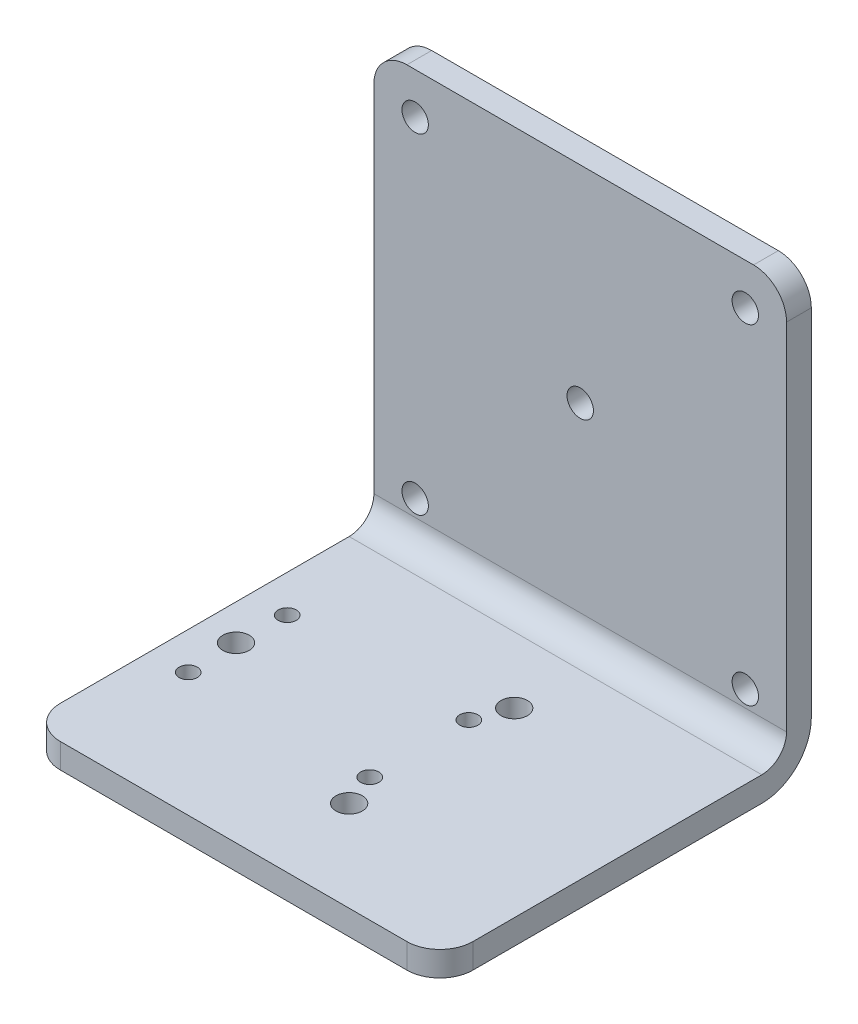
ISO-10303-21;
HEADER;
FILE_DESCRIPTION(('STEP AP214'),'2;1');
FILE_NAME('part.step','',(''),(''),'','','');
FILE_SCHEMA(('AUTOMOTIVE_DESIGN { 1 0 10303 214 1 1 1 1 }'));
ENDSEC;
DATA;
#1=APPLICATION_CONTEXT('core data for automotive mechanical design processes');
#2=APPLICATION_PROTOCOL_DEFINITION('international standard','automotive_design',2000,#1);
#3=PRODUCT_CONTEXT('',#1,'mechanical');
#4=PRODUCT('Part','Part','',(#3));
#5=PRODUCT_RELATED_PRODUCT_CATEGORY('part','',(#4));
#6=PRODUCT_DEFINITION_FORMATION('','',#4);
#7=PRODUCT_DEFINITION_CONTEXT('part definition',#1,'design');
#8=PRODUCT_DEFINITION('design','',#6,#7);
#9=PRODUCT_DEFINITION_SHAPE('','',#8);
#10=(LENGTH_UNIT() NAMED_UNIT(*) SI_UNIT(.MILLI.,.METRE.));
#11=(NAMED_UNIT(*) PLANE_ANGLE_UNIT() SI_UNIT($,.RADIAN.));
#12=(NAMED_UNIT(*) SI_UNIT($,.STERADIAN.) SOLID_ANGLE_UNIT());
#13=UNCERTAINTY_MEASURE_WITH_UNIT(LENGTH_MEASURE(1.E-05),#10,'distance_accuracy_value','');
#14=(GEOMETRIC_REPRESENTATION_CONTEXT(3) GLOBAL_UNCERTAINTY_ASSIGNED_CONTEXT((#13)) GLOBAL_UNIT_ASSIGNED_CONTEXT((#10,
#11,#12)) REPRESENTATION_CONTEXT('',''));
#15=CARTESIAN_POINT('',(0.,0.,0.));
#16=DIRECTION('',(0.,0.,1.));
#17=DIRECTION('',(1.,0.,0.));
#18=AXIS2_PLACEMENT_3D('',#15,#16,#17);
#19=CARTESIAN_POINT('',(0.,3.,0.));
#20=DIRECTION('',(0.,-1.,0.));
#21=DIRECTION('',(0.,0.,-1.));
#22=AXIS2_PLACEMENT_3D('',#19,#20,#21);
#23=PLANE('',#22);
#24=CARTESIAN_POINT('',(2.99999999999999,3.,-8.5));
#25=DIRECTION('',(0.,1.,0.));
#26=DIRECTION('',(0.,0.,1.));
#27=AXIS2_PLACEMENT_3D('',#24,#25,#26);
#28=CIRCLE('',#27,1.6);
#29=CARTESIAN_POINT('',(2.99999999999999,3.,-6.9));
#30=VERTEX_POINT('',#29);
#31=EDGE_CURVE('E518',#30,#30,#28,.T.);
#32=ORIENTED_EDGE('',*,*,#31,.F.);
#33=EDGE_LOOP('',(#32));
#34=FACE_BOUND('',#33,.T.);
#35=CARTESIAN_POINT('',(-20.5,3.,7.5));
#36=DIRECTION('',(0.,1.,0.));
#37=DIRECTION('',(0.,0.,-1.));
#38=AXIS2_PLACEMENT_3D('',#35,#36,#37);
#39=CIRCLE('',#38,1.1);
#40=CARTESIAN_POINT('',(-20.5,3.,6.4));
#41=VERTEX_POINT('',#40);
#42=EDGE_CURVE('E534',#41,#41,#39,.T.);
#43=ORIENTED_EDGE('',*,*,#42,.F.);
#44=EDGE_LOOP('',(#43));
#45=FACE_BOUND('',#44,.T.);
#46=CARTESIAN_POINT('',(-20.5,3.,-4.5));
#47=DIRECTION('',(0.,1.,0.));
#48=DIRECTION('',(0.,0.,1.));
#49=AXIS2_PLACEMENT_3D('',#46,#47,#48);
#50=CIRCLE('',#49,1.1);
#51=CARTESIAN_POINT('',(-20.5,3.,-3.4));
#52=VERTEX_POINT('',#51);
#53=EDGE_CURVE('E533',#52,#52,#50,.T.);
#54=ORIENTED_EDGE('',*,*,#53,.F.);
#55=EDGE_LOOP('',(#54));
#56=FACE_BOUND('',#55,.T.);
#57=CARTESIAN_POINT('',(1.49999999999998,3.,-4.5));
#58=DIRECTION('',(0.,1.,0.));
#59=DIRECTION('',(0.,0.,1.));
#60=AXIS2_PLACEMENT_3D('',#57,#58,#59);
#61=CIRCLE('',#60,1.1);
#62=CARTESIAN_POINT('',(1.49999999999998,3.,-3.4));
#63=VERTEX_POINT('',#62);
#64=EDGE_CURVE('E511',#63,#63,#61,.T.);
#65=ORIENTED_EDGE('',*,*,#64,.F.);
#66=EDGE_LOOP('',(#65));
#67=FACE_BOUND('',#66,.T.);
#68=CARTESIAN_POINT('',(2.99999999999999,3.,11.5));
#69=DIRECTION('',(0.,1.,0.));
#70=DIRECTION('',(0.,0.,-1.));
#71=AXIS2_PLACEMENT_3D('',#68,#69,#70);
#72=CIRCLE('',#71,1.6);
#73=CARTESIAN_POINT('',(2.99999999999999,3.,9.9));
#74=VERTEX_POINT('',#73);
#75=EDGE_CURVE('E519',#74,#74,#72,.T.);
#76=ORIENTED_EDGE('',*,*,#75,.F.);
#77=EDGE_LOOP('',(#76));
#78=FACE_BOUND('',#77,.T.);
#79=CARTESIAN_POINT('',(-20.7,3.,1.5));
#80=DIRECTION('',(0.,1.,0.));
#81=DIRECTION('',(0.,0.,1.));
#82=AXIS2_PLACEMENT_3D('',#79,#80,#81);
#83=CIRCLE('',#82,1.60000000000001);
#84=CARTESIAN_POINT('',(-20.7,3.,3.10000000000001));
#85=VERTEX_POINT('',#84);
#86=EDGE_CURVE('E502',#85,#85,#83,.T.);
#87=ORIENTED_EDGE('',*,*,#86,.F.);
#88=EDGE_LOOP('',(#87));
#89=FACE_BOUND('',#88,.T.);
#90=CARTESIAN_POINT('',(1.49999999999998,3.,7.5));
#91=DIRECTION('',(0.,1.,0.));
#92=DIRECTION('',(0.,0.,-1.));
#93=AXIS2_PLACEMENT_3D('',#90,#91,#92);
#94=CIRCLE('',#93,1.1);
#95=CARTESIAN_POINT('',(1.49999999999998,3.,6.4));
#96=VERTEX_POINT('',#95);
#97=EDGE_CURVE('E497',#96,#96,#94,.T.);
#98=ORIENTED_EDGE('',*,*,#97,.F.);
#99=EDGE_LOOP('',(#98));
#100=FACE_BOUND('',#99,.T.);
#101=DIRECTION('',(0.,0.,-1.));
#102=VECTOR('',#101,1.);
#103=CARTESIAN_POINT('',(25.,3.,22.5));
#104=LINE('',#103,#102);
#105=CARTESIAN_POINT('',(25.,3.,18.5));
#106=VERTEX_POINT('',#105);
#107=CARTESIAN_POINT('',(25.,3.,-16.5));
#108=VERTEX_POINT('',#107);
#109=EDGE_CURVE('E139',#106,#108,#104,.T.);
#110=ORIENTED_EDGE('',*,*,#109,.T.);
#111=DIRECTION('',(1.,0.,0.));
#112=VECTOR('',#111,1.);
#113=CARTESIAN_POINT('',(-25.,3.,-16.5));
#114=LINE('',#113,#112);
#115=CARTESIAN_POINT('',(-25.,3.,-16.5));
#116=VERTEX_POINT('',#115);
#117=EDGE_CURVE('E193',#108,#116,#114,.F.);
#118=ORIENTED_EDGE('',*,*,#117,.T.);
#119=DIRECTION('',(0.,0.,1.));
#120=VECTOR('',#119,1.);
#121=CARTESIAN_POINT('',(-25.,3.,22.5));
#122=LINE('',#121,#120);
#123=CARTESIAN_POINT('',(-25.,3.,18.5));
#124=VERTEX_POINT('',#123);
#125=EDGE_CURVE('E231',#116,#124,#122,.T.);
#126=ORIENTED_EDGE('',*,*,#125,.T.);
#127=CARTESIAN_POINT('',(-21.,3.,18.5));
#128=DIRECTION('',(0.,-1.,0.));
#129=DIRECTION('',(0.,0.,-1.));
#130=AXIS2_PLACEMENT_3D('',#127,#128,#129);
#131=CIRCLE('',#130,4.);
#132=CARTESIAN_POINT('',(-21.,3.,22.5));
#133=VERTEX_POINT('',#132);
#134=EDGE_CURVE('E167',#124,#133,#131,.F.);
#135=ORIENTED_EDGE('',*,*,#134,.T.);
#136=DIRECTION('',(1.,0.,0.));
#137=VECTOR('',#136,1.);
#138=CARTESIAN_POINT('',(-25.,3.,22.5));
#139=LINE('',#138,#137);
#140=CARTESIAN_POINT('',(21.,3.,22.5));
#141=VERTEX_POINT('',#140);
#142=EDGE_CURVE('E152',#133,#141,#139,.T.);
#143=ORIENTED_EDGE('',*,*,#142,.T.);
#144=CARTESIAN_POINT('',(21.,3.,18.5));
#145=DIRECTION('',(0.,-1.,0.));
#146=DIRECTION('',(0.,0.,-1.));
#147=AXIS2_PLACEMENT_3D('',#144,#145,#146);
#148=CIRCLE('',#147,4.);
#149=EDGE_CURVE('E169',#141,#106,#148,.F.);
#150=ORIENTED_EDGE('',*,*,#149,.T.);
#151=EDGE_LOOP('',(#110,#118,#126,#135,#143,#150));
#152=FACE_BOUND('',#151,.T.);
#153=ADVANCED_FACE('F34',(#34,#45,#56,#67,#78,#89,#100,#152),#23,.F.);
#154=CARTESIAN_POINT('',(25.,3.,22.5));
#155=DIRECTION('',(-1.,0.,0.));
#156=DIRECTION('',(0.,0.,1.));
#157=AXIS2_PLACEMENT_3D('',#154,#155,#156);
#158=PLANE('',#157);
#159=DIRECTION('',(0.,0.,-1.));
#160=VECTOR('',#159,1.);
#161=CARTESIAN_POINT('',(25.,0.,22.5));
#162=LINE('',#161,#160);
#163=CARTESIAN_POINT('',(25.,0.,18.5));
#164=VERTEX_POINT('',#163);
#165=CARTESIAN_POINT('',(25.,0.,-16.5));
#166=VERTEX_POINT('',#165);
#167=EDGE_CURVE('E136',#164,#166,#162,.T.);
#168=ORIENTED_EDGE('',*,*,#167,.T.);
#169=CARTESIAN_POINT('',(25.,6.,-16.5));
#170=DIRECTION('',(-1.,0.,0.));
#171=DIRECTION('',(0.,0.,1.));
#172=AXIS2_PLACEMENT_3D('',#169,#170,#171);
#173=CIRCLE('',#172,6.);
#174=CARTESIAN_POINT('',(25.,6.,-22.5));
#175=VERTEX_POINT('',#174);
#176=EDGE_CURVE('E11',#166,#175,#173,.F.);
#177=ORIENTED_EDGE('',*,*,#176,.T.);
#178=DIRECTION('',(0.,-1.,0.));
#179=VECTOR('',#178,1.);
#180=CARTESIAN_POINT('',(25.,3.,-22.5));
#181=LINE('',#180,#179);
#182=CARTESIAN_POINT('',(25.,49.,-22.5));
#183=VERTEX_POINT('',#182);
#184=EDGE_CURVE('E158',#183,#175,#181,.T.);
#185=ORIENTED_EDGE('',*,*,#184,.F.);
#186=DIRECTION('',(0.,0.,-1.));
#187=VECTOR('',#186,1.);
#188=CARTESIAN_POINT('',(25.,49.,-19.5));
#189=LINE('',#188,#187);
#190=CARTESIAN_POINT('',(25.,49.,-19.5));
#191=VERTEX_POINT('',#190);
#192=EDGE_CURVE('E140',#183,#191,#189,.F.);
#193=ORIENTED_EDGE('',*,*,#192,.T.);
#194=DIRECTION('',(0.,-1.,0.));
#195=VECTOR('',#194,1.);
#196=CARTESIAN_POINT('',(25.,53.,-19.5));
#197=LINE('',#196,#195);
#198=CARTESIAN_POINT('',(25.,6.,-19.5));
#199=VERTEX_POINT('',#198);
#200=EDGE_CURVE('E149',#191,#199,#197,.T.);
#201=ORIENTED_EDGE('',*,*,#200,.T.);
#202=CARTESIAN_POINT('',(25.,6.,-16.5));
#203=DIRECTION('',(-1.,0.,0.));
#204=DIRECTION('',(0.,0.,1.));
#205=AXIS2_PLACEMENT_3D('',#202,#203,#204);
#206=CIRCLE('',#205,3.);
#207=EDGE_CURVE('E195',#199,#108,#206,.T.);
#208=ORIENTED_EDGE('',*,*,#207,.T.);
#209=ORIENTED_EDGE('',*,*,#109,.F.);
#210=DIRECTION('',(0.,-1.,0.));
#211=VECTOR('',#210,1.);
#212=CARTESIAN_POINT('',(25.,3.,18.5));
#213=LINE('',#212,#211);
#214=EDGE_CURVE('E126',#106,#164,#213,.T.);
#215=ORIENTED_EDGE('',*,*,#214,.T.);
#216=EDGE_LOOP('',(#168,#177,#185,#193,#201,#208,#209,#215));
#217=FACE_BOUND('',#216,.T.);
#218=ADVANCED_FACE('F135',(#217),#158,.F.);
#219=CARTESIAN_POINT('',(-25.,3.,-22.5));
#220=DIRECTION('',(0.,0.,1.));
#221=DIRECTION('',(1.,0.,0.));
#222=AXIS2_PLACEMENT_3D('',#219,#220,#221);
#223=PLANE('',#222);
#224=CARTESIAN_POINT('',(0.,28.,-22.5));
#225=DIRECTION('',(0.,0.,1.));
#226=DIRECTION('',(1.,0.,0.));
#227=AXIS2_PLACEMENT_3D('',#224,#225,#226);
#228=CIRCLE('',#227,1.6);
#229=CARTESIAN_POINT('',(1.6,28.,-22.5));
#230=VERTEX_POINT('',#229);
#231=EDGE_CURVE('E552',#230,#230,#228,.F.);
#232=ORIENTED_EDGE('',*,*,#231,.F.);
#233=EDGE_LOOP('',(#232));
#234=FACE_BOUND('',#233,.T.);
#235=CARTESIAN_POINT('',(-20.,8.00000000000001,-22.5));
#236=DIRECTION('',(0.,0.,1.));
#237=DIRECTION('',(1.,0.,0.));
#238=AXIS2_PLACEMENT_3D('',#235,#236,#237);
#239=CIRCLE('',#238,1.6);
#240=CARTESIAN_POINT('',(-18.4,8.00000000000001,-22.5));
#241=VERTEX_POINT('',#240);
#242=EDGE_CURVE('E559',#241,#241,#239,.F.);
#243=ORIENTED_EDGE('',*,*,#242,.F.);
#244=EDGE_LOOP('',(#243));
#245=FACE_BOUND('',#244,.T.);
#246=CARTESIAN_POINT('',(20.,8.,-22.5));
#247=DIRECTION('',(0.,0.,1.));
#248=DIRECTION('',(1.,0.,0.));
#249=AXIS2_PLACEMENT_3D('',#246,#247,#248);
#250=CIRCLE('',#249,1.6);
#251=CARTESIAN_POINT('',(21.6,8.,-22.5));
#252=VERTEX_POINT('',#251);
#253=EDGE_CURVE('E565',#252,#252,#250,.F.);
#254=ORIENTED_EDGE('',*,*,#253,.F.);
#255=EDGE_LOOP('',(#254));
#256=FACE_BOUND('',#255,.T.);
#257=CARTESIAN_POINT('',(20.,48.,-22.5));
#258=DIRECTION('',(0.,0.,1.));
#259=DIRECTION('',(1.,0.,0.));
#260=AXIS2_PLACEMENT_3D('',#257,#258,#259);
#261=CIRCLE('',#260,1.6);
#262=CARTESIAN_POINT('',(21.6,48.,-22.5));
#263=VERTEX_POINT('',#262);
#264=EDGE_CURVE('E551',#263,#263,#261,.F.);
#265=ORIENTED_EDGE('',*,*,#264,.F.);
#266=EDGE_LOOP('',(#265));
#267=FACE_BOUND('',#266,.T.);
#268=CARTESIAN_POINT('',(-20.,48.,-22.5));
#269=DIRECTION('',(0.,0.,1.));
#270=DIRECTION('',(1.,0.,0.));
#271=AXIS2_PLACEMENT_3D('',#268,#269,#270);
#272=CIRCLE('',#271,1.6);
#273=CARTESIAN_POINT('',(-18.4,48.,-22.5));
#274=VERTEX_POINT('',#273);
#275=EDGE_CURVE('E537',#274,#274,#272,.F.);
#276=ORIENTED_EDGE('',*,*,#275,.F.);
#277=EDGE_LOOP('',(#276));
#278=FACE_BOUND('',#277,.T.);
#279=ORIENTED_EDGE('',*,*,#184,.T.);
#280=DIRECTION('',(-1.,0.,0.));
#281=VECTOR('',#280,1.);
#282=CARTESIAN_POINT('',(-25.,6.,-22.5));
#283=LINE('',#282,#281);
#284=CARTESIAN_POINT('',(-25.,6.,-22.5));
#285=VERTEX_POINT('',#284);
#286=EDGE_CURVE('E199',#175,#285,#283,.T.);
#287=ORIENTED_EDGE('',*,*,#286,.T.);
#288=DIRECTION('',(0.,-1.,0.));
#289=VECTOR('',#288,1.);
#290=CARTESIAN_POINT('',(-25.,3.,-22.5));
#291=LINE('',#290,#289);
#292=CARTESIAN_POINT('',(-25.,49.,-22.5));
#293=VERTEX_POINT('',#292);
#294=EDGE_CURVE('E156',#293,#285,#291,.T.);
#295=ORIENTED_EDGE('',*,*,#294,.F.);
#296=CARTESIAN_POINT('',(-21.,49.,-22.5));
#297=DIRECTION('',(0.,0.,1.));
#298=DIRECTION('',(1.,0.,0.));
#299=AXIS2_PLACEMENT_3D('',#296,#297,#298);
#300=CIRCLE('',#299,4.);
#301=CARTESIAN_POINT('',(-21.,53.,-22.5));
#302=VERTEX_POINT('',#301);
#303=EDGE_CURVE('E182',#293,#302,#300,.F.);
#304=ORIENTED_EDGE('',*,*,#303,.T.);
#305=DIRECTION('',(-1.,0.,0.));
#306=VECTOR('',#305,1.);
#307=CARTESIAN_POINT('',(-25.,53.,-22.5));
#308=LINE('',#307,#306);
#309=CARTESIAN_POINT('',(21.,53.,-22.5));
#310=VERTEX_POINT('',#309);
#311=EDGE_CURVE('E217',#310,#302,#308,.T.);
#312=ORIENTED_EDGE('',*,*,#311,.F.);
#313=CARTESIAN_POINT('',(21.,49.,-22.5));
#314=DIRECTION('',(0.,0.,1.));
#315=DIRECTION('',(1.,0.,0.));
#316=AXIS2_PLACEMENT_3D('',#313,#314,#315);
#317=CIRCLE('',#316,4.);
#318=EDGE_CURVE('E184',#310,#183,#317,.F.);
#319=ORIENTED_EDGE('',*,*,#318,.T.);
#320=EDGE_LOOP('',(#279,#287,#295,#304,#312,#319));
#321=FACE_BOUND('',#320,.T.);
#322=ADVANCED_FACE('F205',(#234,#245,#256,#267,#278,#321),#223,.F.);
#323=CARTESIAN_POINT('',(-25.,3.,22.5));
#324=DIRECTION('',(1.,0.,0.));
#325=DIRECTION('',(0.,0.,-1.));
#326=AXIS2_PLACEMENT_3D('',#323,#324,#325);
#327=PLANE('',#326);
#328=ORIENTED_EDGE('',*,*,#294,.T.);
#329=CARTESIAN_POINT('',(-25.,6.,-16.5));
#330=DIRECTION('',(1.,0.,0.));
#331=DIRECTION('',(0.,0.,-1.));
#332=AXIS2_PLACEMENT_3D('',#329,#330,#331);
#333=CIRCLE('',#332,6.);
#334=CARTESIAN_POINT('',(-25.,0.,-16.5));
#335=VERTEX_POINT('',#334);
#336=EDGE_CURVE('E56',#285,#335,#333,.F.);
#337=ORIENTED_EDGE('',*,*,#336,.T.);
#338=DIRECTION('',(0.,0.,1.));
#339=VECTOR('',#338,1.);
#340=CARTESIAN_POINT('',(-25.,0.,22.5));
#341=LINE('',#340,#339);
#342=CARTESIAN_POINT('',(-25.,0.,18.5));
#343=VERTEX_POINT('',#342);
#344=EDGE_CURVE('E143',#335,#343,#341,.T.);
#345=ORIENTED_EDGE('',*,*,#344,.T.);
#346=DIRECTION('',(0.,-1.,0.));
#347=VECTOR('',#346,1.);
#348=CARTESIAN_POINT('',(-25.,3.,18.5));
#349=LINE('',#348,#347);
#350=EDGE_CURVE('E173',#343,#124,#349,.F.);
#351=ORIENTED_EDGE('',*,*,#350,.T.);
#352=ORIENTED_EDGE('',*,*,#125,.F.);
#353=CARTESIAN_POINT('',(-25.,6.,-16.5));
#354=DIRECTION('',(1.,0.,0.));
#355=DIRECTION('',(0.,0.,-1.));
#356=AXIS2_PLACEMENT_3D('',#353,#354,#355);
#357=CIRCLE('',#356,3.);
#358=CARTESIAN_POINT('',(-25.,6.,-19.5));
#359=VERTEX_POINT('',#358);
#360=EDGE_CURVE('E197',#116,#359,#357,.T.);
#361=ORIENTED_EDGE('',*,*,#360,.T.);
#362=DIRECTION('',(0.,-1.,0.));
#363=VECTOR('',#362,1.);
#364=CARTESIAN_POINT('',(-25.,53.,-19.5));
#365=LINE('',#364,#363);
#366=CARTESIAN_POINT('',(-25.,49.,-19.5));
#367=VERTEX_POINT('',#366);
#368=EDGE_CURVE('E144',#367,#359,#365,.T.);
#369=ORIENTED_EDGE('',*,*,#368,.F.);
#370=DIRECTION('',(0.,0.,1.));
#371=VECTOR('',#370,1.);
#372=CARTESIAN_POINT('',(-25.,49.,-22.5));
#373=LINE('',#372,#371);
#374=EDGE_CURVE('E171',#367,#293,#373,.F.);
#375=ORIENTED_EDGE('',*,*,#374,.T.);
#376=EDGE_LOOP('',(#328,#337,#345,#351,#352,#361,#369,#375));
#377=FACE_BOUND('',#376,.T.);
#378=ADVANCED_FACE('F209',(#377),#327,.F.);
#379=CARTESIAN_POINT('',(-25.,3.,22.5));
#380=DIRECTION('',(0.,0.,-1.));
#381=DIRECTION('',(-1.,0.,0.));
#382=AXIS2_PLACEMENT_3D('',#379,#380,#381);
#383=PLANE('',#382);
#384=DIRECTION('',(1.,0.,0.));
#385=VECTOR('',#384,1.);
#386=CARTESIAN_POINT('',(-25.,0.,22.5));
#387=LINE('',#386,#385);
#388=CARTESIAN_POINT('',(-21.,0.,22.5));
#389=VERTEX_POINT('',#388);
#390=CARTESIAN_POINT('',(21.,0.,22.5));
#391=VERTEX_POINT('',#390);
#392=EDGE_CURVE('E146',#389,#391,#387,.T.);
#393=ORIENTED_EDGE('',*,*,#392,.T.);
#394=DIRECTION('',(0.,-1.,0.));
#395=VECTOR('',#394,1.);
#396=CARTESIAN_POINT('',(21.,3.,22.5));
#397=LINE('',#396,#395);
#398=EDGE_CURVE('E127',#391,#141,#397,.F.);
#399=ORIENTED_EDGE('',*,*,#398,.T.);
#400=ORIENTED_EDGE('',*,*,#142,.F.);
#401=DIRECTION('',(0.,-1.,0.));
#402=VECTOR('',#401,1.);
#403=CARTESIAN_POINT('',(-21.,3.,22.5));
#404=LINE('',#403,#402);
#405=EDGE_CURVE('E130',#133,#389,#404,.T.);
#406=ORIENTED_EDGE('',*,*,#405,.T.);
#407=EDGE_LOOP('',(#393,#399,#400,#406));
#408=FACE_BOUND('',#407,.T.);
#409=ADVANCED_FACE('F239',(#408),#383,.F.);
#410=CARTESIAN_POINT('',(0.,0.,0.));
#411=DIRECTION('',(0.,-1.,0.));
#412=DIRECTION('',(0.,0.,-1.));
#413=AXIS2_PLACEMENT_3D('',#410,#411,#412);
#414=PLANE('',#413);
#415=CARTESIAN_POINT('',(2.99999999999999,0.,-8.5));
#416=DIRECTION('',(0.,-1.,0.));
#417=DIRECTION('',(0.,0.,-1.));
#418=AXIS2_PLACEMENT_3D('',#415,#416,#417);
#419=CIRCLE('',#418,1.6);
#420=CARTESIAN_POINT('',(2.99999999999999,0.,-10.1));
#421=VERTEX_POINT('',#420);
#422=EDGE_CURVE('E227',#421,#421,#419,.F.);
#423=ORIENTED_EDGE('',*,*,#422,.T.);
#424=EDGE_LOOP('',(#423));
#425=FACE_BOUND('',#424,.T.);
#426=CARTESIAN_POINT('',(-20.5,0.,7.5));
#427=DIRECTION('',(0.,-1.,0.));
#428=DIRECTION('',(0.,0.,-1.));
#429=AXIS2_PLACEMENT_3D('',#426,#427,#428);
#430=CIRCLE('',#429,1.1);
#431=CARTESIAN_POINT('',(-20.5,0.,6.4));
#432=VERTEX_POINT('',#431);
#433=EDGE_CURVE('E530',#432,#432,#430,.F.);
#434=ORIENTED_EDGE('',*,*,#433,.T.);
#435=EDGE_LOOP('',(#434));
#436=FACE_BOUND('',#435,.T.);
#437=CARTESIAN_POINT('',(-20.5,0.,-4.5));
#438=DIRECTION('',(0.,-1.,0.));
#439=DIRECTION('',(0.,0.,-1.));
#440=AXIS2_PLACEMENT_3D('',#437,#438,#439);
#441=CIRCLE('',#440,1.1);
#442=CARTESIAN_POINT('',(-20.5,0.,-5.6));
#443=VERTEX_POINT('',#442);
#444=EDGE_CURVE('E507',#443,#443,#441,.F.);
#445=ORIENTED_EDGE('',*,*,#444,.T.);
#446=EDGE_LOOP('',(#445));
#447=FACE_BOUND('',#446,.T.);
#448=CARTESIAN_POINT('',(1.49999999999998,0.,-4.5));
#449=DIRECTION('',(0.,-1.,0.));
#450=DIRECTION('',(0.,0.,-1.));
#451=AXIS2_PLACEMENT_3D('',#448,#449,#450);
#452=CIRCLE('',#451,1.1);
#453=CARTESIAN_POINT('',(1.49999999999998,0.,-5.6));
#454=VERTEX_POINT('',#453);
#455=EDGE_CURVE('E514',#454,#454,#452,.F.);
#456=ORIENTED_EDGE('',*,*,#455,.T.);
#457=EDGE_LOOP('',(#456));
#458=FACE_BOUND('',#457,.T.);
#459=CARTESIAN_POINT('',(2.99999999999999,0.,11.5));
#460=DIRECTION('',(0.,-1.,0.));
#461=DIRECTION('',(0.,0.,-1.));
#462=AXIS2_PLACEMENT_3D('',#459,#460,#461);
#463=CIRCLE('',#462,1.6);
#464=CARTESIAN_POINT('',(2.99999999999999,0.,9.9));
#465=VERTEX_POINT('',#464);
#466=EDGE_CURVE('E515',#465,#465,#463,.F.);
#467=ORIENTED_EDGE('',*,*,#466,.T.);
#468=EDGE_LOOP('',(#467));
#469=FACE_BOUND('',#468,.T.);
#470=CARTESIAN_POINT('',(-20.7,0.,1.5));
#471=DIRECTION('',(0.,-1.,0.));
#472=DIRECTION('',(0.,0.,-1.));
#473=AXIS2_PLACEMENT_3D('',#470,#471,#472);
#474=CIRCLE('',#473,1.60000000000001);
#475=CARTESIAN_POINT('',(-20.7,0.,-0.100000000000004));
#476=VERTEX_POINT('',#475);
#477=EDGE_CURVE('E505',#476,#476,#474,.F.);
#478=ORIENTED_EDGE('',*,*,#477,.T.);
#479=EDGE_LOOP('',(#478));
#480=FACE_BOUND('',#479,.T.);
#481=CARTESIAN_POINT('',(1.49999999999998,0.,7.5));
#482=DIRECTION('',(0.,-1.,0.));
#483=DIRECTION('',(0.,0.,-1.));
#484=AXIS2_PLACEMENT_3D('',#481,#482,#483);
#485=CIRCLE('',#484,1.1);
#486=CARTESIAN_POINT('',(1.49999999999998,0.,6.4));
#487=VERTEX_POINT('',#486);
#488=EDGE_CURVE('E500',#487,#487,#485,.F.);
#489=ORIENTED_EDGE('',*,*,#488,.T.);
#490=EDGE_LOOP('',(#489));
#491=FACE_BOUND('',#490,.T.);
#492=ORIENTED_EDGE('',*,*,#344,.F.);
#493=DIRECTION('',(-1.,0.,0.));
#494=VECTOR('',#493,1.);
#495=CARTESIAN_POINT('',(25.,0.,-16.5));
#496=LINE('',#495,#494);
#497=EDGE_CURVE('E42',#335,#166,#496,.F.);
#498=ORIENTED_EDGE('',*,*,#497,.T.);
#499=ORIENTED_EDGE('',*,*,#167,.F.);
#500=CARTESIAN_POINT('',(21.,0.,18.5));
#501=DIRECTION('',(0.,-1.,0.));
#502=DIRECTION('',(0.,0.,-1.));
#503=AXIS2_PLACEMENT_3D('',#500,#501,#502);
#504=CIRCLE('',#503,4.);
#505=EDGE_CURVE('E122',#164,#391,#504,.T.);
#506=ORIENTED_EDGE('',*,*,#505,.T.);
#507=ORIENTED_EDGE('',*,*,#392,.F.);
#508=CARTESIAN_POINT('',(-21.,0.,18.5));
#509=DIRECTION('',(0.,-1.,0.));
#510=DIRECTION('',(0.,0.,-1.));
#511=AXIS2_PLACEMENT_3D('',#508,#509,#510);
#512=CIRCLE('',#511,4.);
#513=EDGE_CURVE('E131',#389,#343,#512,.T.);
#514=ORIENTED_EDGE('',*,*,#513,.T.);
#515=EDGE_LOOP('',(#492,#498,#499,#506,#507,#514));
#516=FACE_BOUND('',#515,.T.);
#517=ADVANCED_FACE('F142',(#425,#436,#447,#458,#469,#480,#491,#516),#414,.T.);
#518=CARTESIAN_POINT('',(-25.,53.,-19.5));
#519=DIRECTION('',(0.,0.,-1.));
#520=DIRECTION('',(-1.,0.,0.));
#521=AXIS2_PLACEMENT_3D('',#518,#519,#520);
#522=PLANE('',#521);
#523=CARTESIAN_POINT('',(0.,28.,-19.5));
#524=DIRECTION('',(0.,0.,1.));
#525=DIRECTION('',(1.,0.,0.));
#526=AXIS2_PLACEMENT_3D('',#523,#524,#525);
#527=CIRCLE('',#526,1.6);
#528=CARTESIAN_POINT('',(1.6,28.,-19.5));
#529=VERTEX_POINT('',#528);
#530=EDGE_CURVE('E556',#529,#529,#527,.T.);
#531=ORIENTED_EDGE('',*,*,#530,.F.);
#532=EDGE_LOOP('',(#531));
#533=FACE_BOUND('',#532,.T.);
#534=CARTESIAN_POINT('',(-20.,8.00000000000001,-19.5));
#535=DIRECTION('',(0.,0.,1.));
#536=DIRECTION('',(1.,0.,0.));
#537=AXIS2_PLACEMENT_3D('',#534,#535,#536);
#538=CIRCLE('',#537,1.6);
#539=CARTESIAN_POINT('',(-18.4,8.00000000000001,-19.5));
#540=VERTEX_POINT('',#539);
#541=EDGE_CURVE('E555',#540,#540,#538,.T.);
#542=ORIENTED_EDGE('',*,*,#541,.F.);
#543=EDGE_LOOP('',(#542));
#544=FACE_BOUND('',#543,.T.);
#545=CARTESIAN_POINT('',(20.,8.,-19.5));
#546=DIRECTION('',(0.,0.,1.));
#547=DIRECTION('',(1.,0.,0.));
#548=AXIS2_PLACEMENT_3D('',#545,#546,#547);
#549=CIRCLE('',#548,1.6);
#550=CARTESIAN_POINT('',(21.6,8.,-19.5));
#551=VERTEX_POINT('',#550);
#552=EDGE_CURVE('E562',#551,#551,#549,.T.);
#553=ORIENTED_EDGE('',*,*,#552,.F.);
#554=EDGE_LOOP('',(#553));
#555=FACE_BOUND('',#554,.T.);
#556=CARTESIAN_POINT('',(20.,48.,-19.5));
#557=DIRECTION('',(0.,0.,1.));
#558=DIRECTION('',(1.,0.,0.));
#559=AXIS2_PLACEMENT_3D('',#556,#557,#558);
#560=CIRCLE('',#559,1.6);
#561=CARTESIAN_POINT('',(21.6,48.,-19.5));
#562=VERTEX_POINT('',#561);
#563=EDGE_CURVE('E568',#562,#562,#560,.T.);
#564=ORIENTED_EDGE('',*,*,#563,.F.);
#565=EDGE_LOOP('',(#564));
#566=FACE_BOUND('',#565,.T.);
#567=CARTESIAN_POINT('',(-20.,48.,-19.5));
#568=DIRECTION('',(0.,0.,1.));
#569=DIRECTION('',(1.,0.,0.));
#570=AXIS2_PLACEMENT_3D('',#567,#568,#569);
#571=CIRCLE('',#570,1.6);
#572=CARTESIAN_POINT('',(-18.4,48.,-19.5));
#573=VERTEX_POINT('',#572);
#574=EDGE_CURVE('E548',#573,#573,#571,.T.);
#575=ORIENTED_EDGE('',*,*,#574,.F.);
#576=EDGE_LOOP('',(#575));
#577=FACE_BOUND('',#576,.T.);
#578=ORIENTED_EDGE('',*,*,#368,.T.);
#579=DIRECTION('',(1.,0.,0.));
#580=VECTOR('',#579,1.);
#581=CARTESIAN_POINT('',(25.,6.,-19.5));
#582=LINE('',#581,#580);
#583=EDGE_CURVE('E190',#359,#199,#582,.T.);
#584=ORIENTED_EDGE('',*,*,#583,.T.);
#585=ORIENTED_EDGE('',*,*,#200,.F.);
#586=CARTESIAN_POINT('',(21.,49.,-19.5));
#587=DIRECTION('',(0.,0.,-1.));
#588=DIRECTION('',(-1.,0.,0.));
#589=AXIS2_PLACEMENT_3D('',#586,#587,#588);
#590=CIRCLE('',#589,4.);
#591=CARTESIAN_POINT('',(21.,53.,-19.5));
#592=VERTEX_POINT('',#591);
#593=EDGE_CURVE('E188',#191,#592,#590,.F.);
#594=ORIENTED_EDGE('',*,*,#593,.T.);
#595=DIRECTION('',(1.,0.,0.));
#596=VECTOR('',#595,1.);
#597=CARTESIAN_POINT('',(-25.,53.,-19.5));
#598=LINE('',#597,#596);
#599=CARTESIAN_POINT('',(-21.,53.,-19.5));
#600=VERTEX_POINT('',#599);
#601=EDGE_CURVE('E223',#600,#592,#598,.T.);
#602=ORIENTED_EDGE('',*,*,#601,.F.);
#603=CARTESIAN_POINT('',(-21.,49.,-19.5));
#604=DIRECTION('',(0.,0.,-1.));
#605=DIRECTION('',(-1.,0.,0.));
#606=AXIS2_PLACEMENT_3D('',#603,#604,#605);
#607=CIRCLE('',#606,4.);
#608=EDGE_CURVE('E186',#600,#367,#607,.F.);
#609=ORIENTED_EDGE('',*,*,#608,.T.);
#610=EDGE_LOOP('',(#578,#584,#585,#594,#602,#609));
#611=FACE_BOUND('',#610,.T.);
#612=ADVANCED_FACE('F249',(#533,#544,#555,#566,#577,#611),#522,.F.);
#613=CARTESIAN_POINT('',(0.,53.,0.));
#614=DIRECTION('',(0.,1.,0.));
#615=DIRECTION('',(0.,0.,1.));
#616=AXIS2_PLACEMENT_3D('',#613,#614,#615);
#617=PLANE('',#616);
#618=ORIENTED_EDGE('',*,*,#601,.T.);
#619=DIRECTION('',(0.,0.,-1.));
#620=VECTOR('',#619,1.);
#621=CARTESIAN_POINT('',(21.,53.,-22.5));
#622=LINE('',#621,#620);
#623=EDGE_CURVE('E179',#592,#310,#622,.T.);
#624=ORIENTED_EDGE('',*,*,#623,.T.);
#625=ORIENTED_EDGE('',*,*,#311,.T.);
#626=DIRECTION('',(0.,0.,1.));
#627=VECTOR('',#626,1.);
#628=CARTESIAN_POINT('',(-21.,53.,-19.5));
#629=LINE('',#628,#627);
#630=EDGE_CURVE('E176',#302,#600,#629,.T.);
#631=ORIENTED_EDGE('',*,*,#630,.T.);
#632=EDGE_LOOP('',(#618,#624,#625,#631));
#633=FACE_BOUND('',#632,.T.);
#634=ADVANCED_FACE('F220',(#633),#617,.T.);
#635=CARTESIAN_POINT('',(1.49999999999998,-4.52548339959392,7.5));
#636=DIRECTION('',(0.,1.,0.));
#637=DIRECTION('',(0.,0.,1.));
#638=AXIS2_PLACEMENT_3D('',#635,#636,#637);
#639=CYLINDRICAL_SURFACE('',#638,1.1);
#640=ORIENTED_EDGE('',*,*,#97,.T.);
#641=EDGE_LOOP('',(#640));
#642=FACE_BOUND('',#641,.T.);
#643=ORIENTED_EDGE('',*,*,#488,.F.);
#644=EDGE_LOOP('',(#643));
#645=FACE_BOUND('',#644,.T.);
#646=ADVANCED_FACE('F366',(#642,#645),#639,.F.);
#647=CARTESIAN_POINT('',(-20.7,-4.52548339959392,1.5));
#648=DIRECTION('',(0.,1.,0.));
#649=DIRECTION('',(0.,0.,1.));
#650=AXIS2_PLACEMENT_3D('',#647,#648,#649);
#651=CYLINDRICAL_SURFACE('',#650,1.60000000000001);
#652=ORIENTED_EDGE('',*,*,#86,.T.);
#653=EDGE_LOOP('',(#652));
#654=FACE_BOUND('',#653,.T.);
#655=ORIENTED_EDGE('',*,*,#477,.F.);
#656=EDGE_LOOP('',(#655));
#657=FACE_BOUND('',#656,.T.);
#658=ADVANCED_FACE('F454',(#654,#657),#651,.F.);
#659=CARTESIAN_POINT('',(2.99999999999999,-4.52548339959392,11.5));
#660=DIRECTION('',(0.,1.,0.));
#661=DIRECTION('',(0.,0.,1.));
#662=AXIS2_PLACEMENT_3D('',#659,#660,#661);
#663=CYLINDRICAL_SURFACE('',#662,1.6);
#664=ORIENTED_EDGE('',*,*,#75,.T.);
#665=EDGE_LOOP('',(#664));
#666=FACE_BOUND('',#665,.T.);
#667=ORIENTED_EDGE('',*,*,#466,.F.);
#668=EDGE_LOOP('',(#667));
#669=FACE_BOUND('',#668,.T.);
#670=ADVANCED_FACE('F446',(#666,#669),#663,.F.);
#671=CARTESIAN_POINT('',(1.49999999999998,-4.52548339959392,-4.5));
#672=DIRECTION('',(0.,1.,0.));
#673=DIRECTION('',(0.,0.,1.));
#674=AXIS2_PLACEMENT_3D('',#671,#672,#673);
#675=CYLINDRICAL_SURFACE('',#674,1.1);
#676=ORIENTED_EDGE('',*,*,#64,.T.);
#677=EDGE_LOOP('',(#676));
#678=FACE_BOUND('',#677,.T.);
#679=ORIENTED_EDGE('',*,*,#455,.F.);
#680=EDGE_LOOP('',(#679));
#681=FACE_BOUND('',#680,.T.);
#682=ADVANCED_FACE('F438',(#678,#681),#675,.F.);
#683=CARTESIAN_POINT('',(-20.5,-4.52548339959392,-4.5));
#684=DIRECTION('',(0.,1.,0.));
#685=DIRECTION('',(0.,0.,1.));
#686=AXIS2_PLACEMENT_3D('',#683,#684,#685);
#687=CYLINDRICAL_SURFACE('',#686,1.1);
#688=ORIENTED_EDGE('',*,*,#53,.T.);
#689=EDGE_LOOP('',(#688));
#690=FACE_BOUND('',#689,.T.);
#691=ORIENTED_EDGE('',*,*,#444,.F.);
#692=EDGE_LOOP('',(#691));
#693=FACE_BOUND('',#692,.T.);
#694=ADVANCED_FACE('F430',(#690,#693),#687,.F.);
#695=CARTESIAN_POINT('',(-20.5,-4.52548339959392,7.5));
#696=DIRECTION('',(0.,1.,0.));
#697=DIRECTION('',(0.,0.,1.));
#698=AXIS2_PLACEMENT_3D('',#695,#696,#697);
#699=CYLINDRICAL_SURFACE('',#698,1.1);
#700=ORIENTED_EDGE('',*,*,#42,.T.);
#701=EDGE_LOOP('',(#700));
#702=FACE_BOUND('',#701,.T.);
#703=ORIENTED_EDGE('',*,*,#433,.F.);
#704=EDGE_LOOP('',(#703));
#705=FACE_BOUND('',#704,.T.);
#706=ADVANCED_FACE('F422',(#702,#705),#699,.F.);
#707=CARTESIAN_POINT('',(2.99999999999999,-4.52548339959392,-8.5));
#708=DIRECTION('',(0.,1.,0.));
#709=DIRECTION('',(0.,0.,1.));
#710=AXIS2_PLACEMENT_3D('',#707,#708,#709);
#711=CYLINDRICAL_SURFACE('',#710,1.6);
#712=ORIENTED_EDGE('',*,*,#31,.T.);
#713=EDGE_LOOP('',(#712));
#714=FACE_BOUND('',#713,.T.);
#715=ORIENTED_EDGE('',*,*,#422,.F.);
#716=EDGE_LOOP('',(#715));
#717=FACE_BOUND('',#716,.T.);
#718=ADVANCED_FACE('F414',(#714,#717),#711,.F.);
#719=CARTESIAN_POINT('',(-20.,48.,-27.0254833995939));
#720=DIRECTION('',(0.,0.,1.));
#721=DIRECTION('',(1.,0.,0.));
#722=AXIS2_PLACEMENT_3D('',#719,#720,#721);
#723=CYLINDRICAL_SURFACE('',#722,1.6);
#724=ORIENTED_EDGE('',*,*,#275,.T.);
#725=EDGE_LOOP('',(#724));
#726=FACE_BOUND('',#725,.T.);
#727=ORIENTED_EDGE('',*,*,#574,.T.);
#728=EDGE_LOOP('',(#727));
#729=FACE_BOUND('',#728,.T.);
#730=ADVANCED_FACE('F406',(#726,#729),#723,.F.);
#731=CARTESIAN_POINT('',(20.,48.,-27.0254833995939));
#732=DIRECTION('',(0.,0.,1.));
#733=DIRECTION('',(1.,0.,0.));
#734=AXIS2_PLACEMENT_3D('',#731,#732,#733);
#735=CYLINDRICAL_SURFACE('',#734,1.6);
#736=ORIENTED_EDGE('',*,*,#264,.T.);
#737=EDGE_LOOP('',(#736));
#738=FACE_BOUND('',#737,.T.);
#739=ORIENTED_EDGE('',*,*,#563,.T.);
#740=EDGE_LOOP('',(#739));
#741=FACE_BOUND('',#740,.T.);
#742=ADVANCED_FACE('F398',(#738,#741),#735,.F.);
#743=CARTESIAN_POINT('',(20.,8.,-27.0254833995939));
#744=DIRECTION('',(0.,0.,1.));
#745=DIRECTION('',(1.,0.,0.));
#746=AXIS2_PLACEMENT_3D('',#743,#744,#745);
#747=CYLINDRICAL_SURFACE('',#746,1.6);
#748=ORIENTED_EDGE('',*,*,#253,.T.);
#749=EDGE_LOOP('',(#748));
#750=FACE_BOUND('',#749,.T.);
#751=ORIENTED_EDGE('',*,*,#552,.T.);
#752=EDGE_LOOP('',(#751));
#753=FACE_BOUND('',#752,.T.);
#754=ADVANCED_FACE('F390',(#750,#753),#747,.F.);
#755=CARTESIAN_POINT('',(-20.,8.00000000000001,-27.0254833995939));
#756=DIRECTION('',(0.,0.,1.));
#757=DIRECTION('',(1.,0.,0.));
#758=AXIS2_PLACEMENT_3D('',#755,#756,#757);
#759=CYLINDRICAL_SURFACE('',#758,1.6);
#760=ORIENTED_EDGE('',*,*,#242,.T.);
#761=EDGE_LOOP('',(#760));
#762=FACE_BOUND('',#761,.T.);
#763=ORIENTED_EDGE('',*,*,#541,.T.);
#764=EDGE_LOOP('',(#763));
#765=FACE_BOUND('',#764,.T.);
#766=ADVANCED_FACE('F385',(#762,#765),#759,.F.);
#767=CARTESIAN_POINT('',(0.,28.,-27.0254833995939));
#768=DIRECTION('',(0.,0.,1.));
#769=DIRECTION('',(1.,0.,0.));
#770=AXIS2_PLACEMENT_3D('',#767,#768,#769);
#771=CYLINDRICAL_SURFACE('',#770,1.6);
#772=ORIENTED_EDGE('',*,*,#231,.T.);
#773=EDGE_LOOP('',(#772));
#774=FACE_BOUND('',#773,.T.);
#775=ORIENTED_EDGE('',*,*,#530,.T.);
#776=EDGE_LOOP('',(#775));
#777=FACE_BOUND('',#776,.T.);
#778=ADVANCED_FACE('F285',(#774,#777),#771,.F.);
#779=CARTESIAN_POINT('',(21.,3.,18.5));
#780=DIRECTION('',(0.,-1.,0.));
#781=DIRECTION('',(0.,0.,-1.));
#782=AXIS2_PLACEMENT_3D('',#779,#780,#781);
#783=CYLINDRICAL_SURFACE('',#782,4.);
#784=ORIENTED_EDGE('',*,*,#149,.F.);
#785=ORIENTED_EDGE('',*,*,#398,.F.);
#786=ORIENTED_EDGE('',*,*,#505,.F.);
#787=ORIENTED_EDGE('',*,*,#214,.F.);
#788=EDGE_LOOP('',(#784,#785,#786,#787));
#789=FACE_BOUND('',#788,.T.);
#790=ADVANCED_FACE('F125',(#789),#783,.T.);
#791=CARTESIAN_POINT('',(-21.,3.,18.5));
#792=DIRECTION('',(0.,-1.,0.));
#793=DIRECTION('',(0.,0.,-1.));
#794=AXIS2_PLACEMENT_3D('',#791,#792,#793);
#795=CYLINDRICAL_SURFACE('',#794,4.);
#796=ORIENTED_EDGE('',*,*,#134,.F.);
#797=ORIENTED_EDGE('',*,*,#350,.F.);
#798=ORIENTED_EDGE('',*,*,#513,.F.);
#799=ORIENTED_EDGE('',*,*,#405,.F.);
#800=EDGE_LOOP('',(#796,#797,#798,#799));
#801=FACE_BOUND('',#800,.T.);
#802=ADVANCED_FACE('F241',(#801),#795,.T.);
#803=CARTESIAN_POINT('',(21.,49.,0.));
#804=DIRECTION('',(0.,0.,1.));
#805=DIRECTION('',(1.,0.,0.));
#806=AXIS2_PLACEMENT_3D('',#803,#804,#805);
#807=CYLINDRICAL_SURFACE('',#806,4.);
#808=ORIENTED_EDGE('',*,*,#593,.F.);
#809=ORIENTED_EDGE('',*,*,#192,.F.);
#810=ORIENTED_EDGE('',*,*,#318,.F.);
#811=ORIENTED_EDGE('',*,*,#623,.F.);
#812=EDGE_LOOP('',(#808,#809,#810,#811));
#813=FACE_BOUND('',#812,.T.);
#814=ADVANCED_FACE('F247',(#813),#807,.T.);
#815=CARTESIAN_POINT('',(-21.,49.,0.));
#816=DIRECTION('',(0.,0.,-1.));
#817=DIRECTION('',(-1.,0.,0.));
#818=AXIS2_PLACEMENT_3D('',#815,#816,#817);
#819=CYLINDRICAL_SURFACE('',#818,4.);
#820=ORIENTED_EDGE('',*,*,#303,.F.);
#821=ORIENTED_EDGE('',*,*,#374,.F.);
#822=ORIENTED_EDGE('',*,*,#608,.F.);
#823=ORIENTED_EDGE('',*,*,#630,.F.);
#824=EDGE_LOOP('',(#820,#821,#822,#823));
#825=FACE_BOUND('',#824,.T.);
#826=ADVANCED_FACE('F213',(#825),#819,.T.);
#827=CARTESIAN_POINT('',(-25.,6.,-16.5));
#828=DIRECTION('',(-1.,0.,0.));
#829=DIRECTION('',(0.,0.,1.));
#830=AXIS2_PLACEMENT_3D('',#827,#828,#829);
#831=CYLINDRICAL_SURFACE('',#830,3.);
#832=ORIENTED_EDGE('',*,*,#360,.F.);
#833=ORIENTED_EDGE('',*,*,#117,.F.);
#834=ORIENTED_EDGE('',*,*,#207,.F.);
#835=ORIENTED_EDGE('',*,*,#583,.F.);
#836=EDGE_LOOP('',(#832,#833,#834,#835));
#837=FACE_BOUND('',#836,.T.);
#838=ADVANCED_FACE('F254',(#837),#831,.F.);
#839=CARTESIAN_POINT('',(-25.,6.,-16.5));
#840=DIRECTION('',(1.,0.,0.));
#841=DIRECTION('',(0.,0.,-1.));
#842=AXIS2_PLACEMENT_3D('',#839,#840,#841);
#843=CYLINDRICAL_SURFACE('',#842,6.);
#844=ORIENTED_EDGE('',*,*,#176,.F.);
#845=ORIENTED_EDGE('',*,*,#497,.F.);
#846=ORIENTED_EDGE('',*,*,#336,.F.);
#847=ORIENTED_EDGE('',*,*,#286,.F.);
#848=EDGE_LOOP('',(#844,#845,#846,#847));
#849=FACE_BOUND('',#848,.T.);
#850=ADVANCED_FACE('F36',(#849),#843,.T.);
#851=CLOSED_SHELL('',(#153,#218,#322,#378,#409,#517,#612,#634,#646,#658,#670,#682,#694,#706,
#718,#730,#742,#754,#766,#778,#790,#802,#814,#826,#838,#850));
#852=MANIFOLD_SOLID_BREP('B2',#851);
#853=ADVANCED_BREP_SHAPE_REPRESENTATION('',(#18,#852),#14);
#854=SHAPE_DEFINITION_REPRESENTATION(#9,#853);
ENDSEC;
END-ISO-10303-21;
